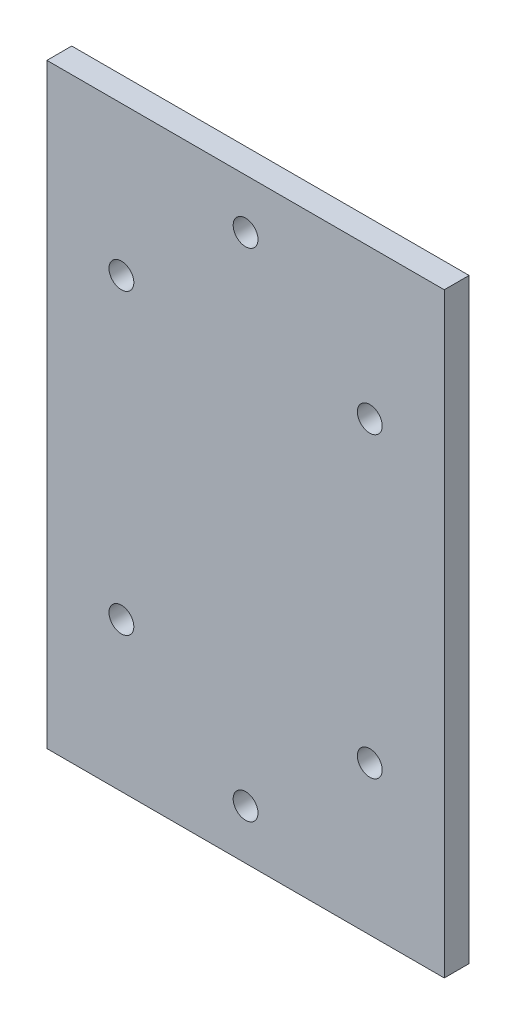
ISO-10303-21;
HEADER;
FILE_DESCRIPTION(('STEP AP214'),'2;1');
FILE_NAME('part.step','',(''),(''),'','','');
FILE_SCHEMA(('AUTOMOTIVE_DESIGN { 1 0 10303 214 1 1 1 1 }'));
ENDSEC;
DATA;
#1=APPLICATION_CONTEXT('core data for automotive mechanical design processes');
#2=APPLICATION_PROTOCOL_DEFINITION('international standard','automotive_design',2000,#1);
#3=PRODUCT_CONTEXT('',#1,'mechanical');
#4=PRODUCT('Part','Part','',(#3));
#5=PRODUCT_RELATED_PRODUCT_CATEGORY('part','',(#4));
#6=PRODUCT_DEFINITION_FORMATION('','',#4);
#7=PRODUCT_DEFINITION_CONTEXT('part definition',#1,'design');
#8=PRODUCT_DEFINITION('design','',#6,#7);
#9=PRODUCT_DEFINITION_SHAPE('','',#8);
#10=(LENGTH_UNIT() NAMED_UNIT(*) SI_UNIT(.MILLI.,.METRE.));
#11=(NAMED_UNIT(*) PLANE_ANGLE_UNIT() SI_UNIT($,.RADIAN.));
#12=(NAMED_UNIT(*) SI_UNIT($,.STERADIAN.) SOLID_ANGLE_UNIT());
#13=UNCERTAINTY_MEASURE_WITH_UNIT(LENGTH_MEASURE(1.E-05),#10,'distance_accuracy_value','');
#14=(GEOMETRIC_REPRESENTATION_CONTEXT(3) GLOBAL_UNCERTAINTY_ASSIGNED_CONTEXT((#13)) GLOBAL_UNIT_ASSIGNED_CONTEXT((#10,
#11,#12)) REPRESENTATION_CONTEXT('',''));
#15=CARTESIAN_POINT('',(0.,0.,0.));
#16=DIRECTION('',(0.,0.,1.));
#17=DIRECTION('',(1.,0.,0.));
#18=AXIS2_PLACEMENT_3D('',#15,#16,#17);
#19=CARTESIAN_POINT('',(0.,-30.,2.5));
#20=DIRECTION('',(0.,1.,0.));
#21=DIRECTION('',(0.,0.,1.));
#22=AXIS2_PLACEMENT_3D('',#19,#20,#21);
#23=PLANE('',#22);
#24=DIRECTION('',(1.,0.,0.));
#25=VECTOR('',#24,1.);
#26=CARTESIAN_POINT('',(0.,-30.,0.));
#27=LINE('',#26,#25);
#28=CARTESIAN_POINT('',(-20.,-30.,0.));
#29=VERTEX_POINT('',#28);
#30=CARTESIAN_POINT('',(20.,-30.,0.));
#31=VERTEX_POINT('',#30);
#32=EDGE_CURVE('E118',#29,#31,#27,.T.);
#33=ORIENTED_EDGE('',*,*,#32,.T.);
#34=DIRECTION('',(0.,0.,-1.));
#35=VECTOR('',#34,1.);
#36=CARTESIAN_POINT('',(20.,-30.,2.5));
#37=LINE('',#36,#35);
#38=CARTESIAN_POINT('',(20.,-30.,2.5));
#39=VERTEX_POINT('',#38);
#40=EDGE_CURVE('E11',#39,#31,#37,.T.);
#41=ORIENTED_EDGE('',*,*,#40,.F.);
#42=DIRECTION('',(1.,0.,0.));
#43=VECTOR('',#42,1.);
#44=CARTESIAN_POINT('',(0.,-30.,2.5));
#45=LINE('',#44,#43);
#46=CARTESIAN_POINT('',(-20.,-30.,2.5));
#47=VERTEX_POINT('',#46);
#48=EDGE_CURVE('E86',#47,#39,#45,.T.);
#49=ORIENTED_EDGE('',*,*,#48,.F.);
#50=DIRECTION('',(0.,0.,-1.));
#51=VECTOR('',#50,1.);
#52=CARTESIAN_POINT('',(-20.,-30.,2.5));
#53=LINE('',#52,#51);
#54=EDGE_CURVE('E52',#47,#29,#53,.T.);
#55=ORIENTED_EDGE('',*,*,#54,.T.);
#56=EDGE_LOOP('',(#33,#41,#49,#55));
#57=FACE_BOUND('',#56,.T.);
#58=ADVANCED_FACE('F35',(#57),#23,.F.);
#59=CARTESIAN_POINT('',(20.,0.,2.5));
#60=DIRECTION('',(-1.,0.,0.));
#61=DIRECTION('',(0.,0.,1.));
#62=AXIS2_PLACEMENT_3D('',#59,#60,#61);
#63=PLANE('',#62);
#64=DIRECTION('',(0.,1.,0.));
#65=VECTOR('',#64,1.);
#66=CARTESIAN_POINT('',(20.,0.,0.));
#67=LINE('',#66,#65);
#68=CARTESIAN_POINT('',(20.,30.,0.));
#69=VERTEX_POINT('',#68);
#70=EDGE_CURVE('E91',#31,#69,#67,.T.);
#71=ORIENTED_EDGE('',*,*,#70,.T.);
#72=DIRECTION('',(0.,0.,-1.));
#73=VECTOR('',#72,1.);
#74=CARTESIAN_POINT('',(20.,30.,2.5));
#75=LINE('',#74,#73);
#76=CARTESIAN_POINT('',(20.,30.,2.5));
#77=VERTEX_POINT('',#76);
#78=EDGE_CURVE('E44',#77,#69,#75,.T.);
#79=ORIENTED_EDGE('',*,*,#78,.F.);
#80=DIRECTION('',(0.,1.,0.));
#81=VECTOR('',#80,1.);
#82=CARTESIAN_POINT('',(20.,0.,2.5));
#83=LINE('',#82,#81);
#84=EDGE_CURVE('E77',#39,#77,#83,.T.);
#85=ORIENTED_EDGE('',*,*,#84,.F.);
#86=ORIENTED_EDGE('',*,*,#40,.T.);
#87=EDGE_LOOP('',(#71,#79,#85,#86));
#88=FACE_BOUND('',#87,.T.);
#89=ADVANCED_FACE('F90',(#88),#63,.F.);
#90=CARTESIAN_POINT('',(0.,30.,2.5));
#91=DIRECTION('',(0.,1.,0.));
#92=DIRECTION('',(0.,0.,1.));
#93=AXIS2_PLACEMENT_3D('',#90,#91,#92);
#94=PLANE('',#93);
#95=DIRECTION('',(1.,0.,0.));
#96=VECTOR('',#95,1.);
#97=CARTESIAN_POINT('',(0.,30.,0.));
#98=LINE('',#97,#96);
#99=CARTESIAN_POINT('',(-20.,30.,0.));
#100=VERTEX_POINT('',#99);
#101=EDGE_CURVE('E121',#100,#69,#98,.T.);
#102=ORIENTED_EDGE('',*,*,#101,.F.);
#103=DIRECTION('',(0.,0.,-1.));
#104=VECTOR('',#103,1.);
#105=CARTESIAN_POINT('',(-20.,30.,2.5));
#106=LINE('',#105,#104);
#107=CARTESIAN_POINT('',(-20.,30.,2.5));
#108=VERTEX_POINT('',#107);
#109=EDGE_CURVE('E66',#108,#100,#106,.T.);
#110=ORIENTED_EDGE('',*,*,#109,.F.);
#111=DIRECTION('',(1.,0.,0.));
#112=VECTOR('',#111,1.);
#113=CARTESIAN_POINT('',(0.,30.,2.5));
#114=LINE('',#113,#112);
#115=EDGE_CURVE('E85',#108,#77,#114,.T.);
#116=ORIENTED_EDGE('',*,*,#115,.T.);
#117=ORIENTED_EDGE('',*,*,#78,.T.);
#118=EDGE_LOOP('',(#102,#110,#116,#117));
#119=FACE_BOUND('',#118,.T.);
#120=ADVANCED_FACE('F94',(#119),#94,.T.);
#121=CARTESIAN_POINT('',(-12.5,15.,2.5));
#122=DIRECTION('',(0.,0.,-1.));
#123=DIRECTION('',(-1.,0.,0.));
#124=AXIS2_PLACEMENT_3D('',#121,#122,#123);
#125=CYLINDRICAL_SURFACE('',#124,1.25);
#126=CARTESIAN_POINT('',(-12.5,15.,2.5));
#127=DIRECTION('',(0.,0.,1.));
#128=DIRECTION('',(1.,0.,0.));
#129=AXIS2_PLACEMENT_3D('',#126,#127,#128);
#130=CIRCLE('',#129,1.25);
#131=CARTESIAN_POINT('',(-11.25,15.,2.5));
#132=VERTEX_POINT('',#131);
#133=EDGE_CURVE('E106',#132,#132,#130,.T.);
#134=ORIENTED_EDGE('',*,*,#133,.T.);
#135=EDGE_LOOP('',(#134));
#136=FACE_BOUND('',#135,.T.);
#137=CARTESIAN_POINT('',(-12.5,15.,0.));
#138=DIRECTION('',(0.,0.,1.));
#139=DIRECTION('',(1.,0.,0.));
#140=AXIS2_PLACEMENT_3D('',#137,#138,#139);
#141=CIRCLE('',#140,1.25);
#142=CARTESIAN_POINT('',(-11.25,15.,0.));
#143=VERTEX_POINT('',#142);
#144=EDGE_CURVE('E132',#143,#143,#141,.T.);
#145=ORIENTED_EDGE('',*,*,#144,.F.);
#146=EDGE_LOOP('',(#145));
#147=FACE_BOUND('',#146,.T.);
#148=ADVANCED_FACE('F190',(#136,#147),#125,.F.);
#149=CARTESIAN_POINT('',(-12.5,-15.,2.5));
#150=DIRECTION('',(0.,0.,-1.));
#151=DIRECTION('',(-1.,0.,0.));
#152=AXIS2_PLACEMENT_3D('',#149,#150,#151);
#153=CYLINDRICAL_SURFACE('',#152,1.25);
#154=CARTESIAN_POINT('',(-12.5,-15.,2.5));
#155=DIRECTION('',(0.,0.,1.));
#156=DIRECTION('',(1.,0.,0.));
#157=AXIS2_PLACEMENT_3D('',#154,#155,#156);
#158=CIRCLE('',#157,1.25);
#159=CARTESIAN_POINT('',(-11.25,-15.,2.5));
#160=VERTEX_POINT('',#159);
#161=EDGE_CURVE('E103',#160,#160,#158,.F.);
#162=ORIENTED_EDGE('',*,*,#161,.F.);
#163=EDGE_LOOP('',(#162));
#164=FACE_BOUND('',#163,.T.);
#165=CARTESIAN_POINT('',(-12.5,-15.,0.));
#166=DIRECTION('',(0.,0.,1.));
#167=DIRECTION('',(1.,0.,0.));
#168=AXIS2_PLACEMENT_3D('',#165,#166,#167);
#169=CIRCLE('',#168,1.25);
#170=CARTESIAN_POINT('',(-11.25,-15.,0.));
#171=VERTEX_POINT('',#170);
#172=EDGE_CURVE('E129',#171,#171,#169,.F.);
#173=ORIENTED_EDGE('',*,*,#172,.T.);
#174=EDGE_LOOP('',(#173));
#175=FACE_BOUND('',#174,.T.);
#176=ADVANCED_FACE('F185',(#164,#175),#153,.F.);
#177=CARTESIAN_POINT('',(12.5,-15.,2.5));
#178=DIRECTION('',(0.,0.,-1.));
#179=DIRECTION('',(-1.,0.,0.));
#180=AXIS2_PLACEMENT_3D('',#177,#178,#179);
#181=CYLINDRICAL_SURFACE('',#180,1.25);
#182=CARTESIAN_POINT('',(12.5,-15.,2.5));
#183=DIRECTION('',(0.,0.,1.));
#184=DIRECTION('',(1.,0.,0.));
#185=AXIS2_PLACEMENT_3D('',#182,#183,#184);
#186=CIRCLE('',#185,1.25);
#187=CARTESIAN_POINT('',(13.75,-15.,2.5));
#188=VERTEX_POINT('',#187);
#189=EDGE_CURVE('E97',#188,#188,#186,.T.);
#190=ORIENTED_EDGE('',*,*,#189,.T.);
#191=EDGE_LOOP('',(#190));
#192=FACE_BOUND('',#191,.T.);
#193=CARTESIAN_POINT('',(12.5,-15.,0.));
#194=DIRECTION('',(0.,0.,1.));
#195=DIRECTION('',(1.,0.,0.));
#196=AXIS2_PLACEMENT_3D('',#193,#194,#195);
#197=CIRCLE('',#196,1.25);
#198=CARTESIAN_POINT('',(13.75,-15.,0.));
#199=VERTEX_POINT('',#198);
#200=EDGE_CURVE('E126',#199,#199,#197,.T.);
#201=ORIENTED_EDGE('',*,*,#200,.F.);
#202=EDGE_LOOP('',(#201));
#203=FACE_BOUND('',#202,.T.);
#204=ADVANCED_FACE('F180',(#192,#203),#181,.F.);
#205=CARTESIAN_POINT('',(-20.,0.,2.5));
#206=DIRECTION('',(-1.,0.,0.));
#207=DIRECTION('',(0.,0.,1.));
#208=AXIS2_PLACEMENT_3D('',#205,#206,#207);
#209=PLANE('',#208);
#210=DIRECTION('',(0.,1.,0.));
#211=VECTOR('',#210,1.);
#212=CARTESIAN_POINT('',(-20.,0.,0.));
#213=LINE('',#212,#211);
#214=EDGE_CURVE('E123',#29,#100,#213,.T.);
#215=ORIENTED_EDGE('',*,*,#214,.F.);
#216=ORIENTED_EDGE('',*,*,#54,.F.);
#217=DIRECTION('',(0.,1.,0.));
#218=VECTOR('',#217,1.);
#219=CARTESIAN_POINT('',(-20.,0.,2.5));
#220=LINE('',#219,#218);
#221=EDGE_CURVE('E95',#47,#108,#220,.T.);
#222=ORIENTED_EDGE('',*,*,#221,.T.);
#223=ORIENTED_EDGE('',*,*,#109,.T.);
#224=EDGE_LOOP('',(#215,#216,#222,#223));
#225=FACE_BOUND('',#224,.T.);
#226=ADVANCED_FACE('F174',(#225),#209,.T.);
#227=CARTESIAN_POINT('',(0.,-25.,2.5));
#228=DIRECTION('',(0.,0.,-1.));
#229=DIRECTION('',(-1.,0.,0.));
#230=AXIS2_PLACEMENT_3D('',#227,#228,#229);
#231=CYLINDRICAL_SURFACE('',#230,1.25);
#232=CARTESIAN_POINT('',(0.,-25.,2.5));
#233=DIRECTION('',(0.,0.,1.));
#234=DIRECTION('',(1.,0.,0.));
#235=AXIS2_PLACEMENT_3D('',#232,#233,#234);
#236=CIRCLE('',#235,1.25);
#237=CARTESIAN_POINT('',(1.25,-25.,2.5));
#238=VERTEX_POINT('',#237);
#239=EDGE_CURVE('E143',#238,#238,#236,.T.);
#240=ORIENTED_EDGE('',*,*,#239,.T.);
#241=EDGE_LOOP('',(#240));
#242=FACE_BOUND('',#241,.T.);
#243=CARTESIAN_POINT('',(0.,-25.,0.));
#244=DIRECTION('',(0.,0.,1.));
#245=DIRECTION('',(1.,0.,0.));
#246=AXIS2_PLACEMENT_3D('',#243,#244,#245);
#247=CIRCLE('',#246,1.25);
#248=CARTESIAN_POINT('',(1.25,-25.,0.));
#249=VERTEX_POINT('',#248);
#250=EDGE_CURVE('E115',#249,#249,#247,.T.);
#251=ORIENTED_EDGE('',*,*,#250,.F.);
#252=EDGE_LOOP('',(#251));
#253=FACE_BOUND('',#252,.T.);
#254=ADVANCED_FACE('F151',(#242,#253),#231,.F.);
#255=CARTESIAN_POINT('',(0.,25.,2.5));
#256=DIRECTION('',(0.,0.,-1.));
#257=DIRECTION('',(-1.,0.,0.));
#258=AXIS2_PLACEMENT_3D('',#255,#256,#257);
#259=CYLINDRICAL_SURFACE('',#258,1.25);
#260=CARTESIAN_POINT('',(0.,25.,2.5));
#261=DIRECTION('',(0.,0.,1.));
#262=DIRECTION('',(1.,0.,0.));
#263=AXIS2_PLACEMENT_3D('',#260,#261,#262);
#264=CIRCLE('',#263,1.25);
#265=CARTESIAN_POINT('',(1.24999999999999,25.,2.5));
#266=VERTEX_POINT('',#265);
#267=EDGE_CURVE('E138',#266,#266,#264,.F.);
#268=ORIENTED_EDGE('',*,*,#267,.F.);
#269=EDGE_LOOP('',(#268));
#270=FACE_BOUND('',#269,.T.);
#271=CARTESIAN_POINT('',(0.,25.,0.));
#272=DIRECTION('',(0.,0.,1.));
#273=DIRECTION('',(1.,0.,0.));
#274=AXIS2_PLACEMENT_3D('',#271,#272,#273);
#275=CIRCLE('',#274,1.25);
#276=CARTESIAN_POINT('',(1.24999999999999,25.,0.));
#277=VERTEX_POINT('',#276);
#278=EDGE_CURVE('E112',#277,#277,#275,.F.);
#279=ORIENTED_EDGE('',*,*,#278,.T.);
#280=EDGE_LOOP('',(#279));
#281=FACE_BOUND('',#280,.T.);
#282=ADVANCED_FACE('F37',(#270,#281),#259,.F.);
#283=CARTESIAN_POINT('',(12.5,15.,2.5));
#284=DIRECTION('',(0.,0.,-1.));
#285=DIRECTION('',(-1.,0.,0.));
#286=AXIS2_PLACEMENT_3D('',#283,#284,#285);
#287=CYLINDRICAL_SURFACE('',#286,1.25);
#288=CARTESIAN_POINT('',(12.5,15.,2.5));
#289=DIRECTION('',(0.,0.,1.));
#290=DIRECTION('',(1.,0.,0.));
#291=AXIS2_PLACEMENT_3D('',#288,#289,#290);
#292=CIRCLE('',#291,1.25);
#293=CARTESIAN_POINT('',(13.75,15.,2.5));
#294=VERTEX_POINT('',#293);
#295=EDGE_CURVE('E109',#294,#294,#292,.F.);
#296=ORIENTED_EDGE('',*,*,#295,.F.);
#297=EDGE_LOOP('',(#296));
#298=FACE_BOUND('',#297,.T.);
#299=CARTESIAN_POINT('',(12.5,15.,0.));
#300=DIRECTION('',(0.,0.,1.));
#301=DIRECTION('',(1.,0.,0.));
#302=AXIS2_PLACEMENT_3D('',#299,#300,#301);
#303=CIRCLE('',#302,1.25);
#304=CARTESIAN_POINT('',(13.75,15.,0.));
#305=VERTEX_POINT('',#304);
#306=EDGE_CURVE('E135',#305,#305,#303,.F.);
#307=ORIENTED_EDGE('',*,*,#306,.T.);
#308=EDGE_LOOP('',(#307));
#309=FACE_BOUND('',#308,.T.);
#310=ADVANCED_FACE('F156',(#298,#309),#287,.F.);
#311=CARTESIAN_POINT('',(0.,0.,2.5));
#312=DIRECTION('',(0.,0.,1.));
#313=DIRECTION('',(1.,0.,0.));
#314=AXIS2_PLACEMENT_3D('',#311,#312,#313);
#315=PLANE('',#314);
#316=ORIENTED_EDGE('',*,*,#267,.T.);
#317=EDGE_LOOP('',(#316));
#318=FACE_BOUND('',#317,.T.);
#319=ORIENTED_EDGE('',*,*,#239,.F.);
#320=EDGE_LOOP('',(#319));
#321=FACE_BOUND('',#320,.T.);
#322=ORIENTED_EDGE('',*,*,#48,.T.);
#323=ORIENTED_EDGE('',*,*,#84,.T.);
#324=ORIENTED_EDGE('',*,*,#115,.F.);
#325=ORIENTED_EDGE('',*,*,#221,.F.);
#326=EDGE_LOOP('',(#322,#323,#324,#325));
#327=FACE_BOUND('',#326,.T.);
#328=ORIENTED_EDGE('',*,*,#189,.F.);
#329=EDGE_LOOP('',(#328));
#330=FACE_BOUND('',#329,.T.);
#331=ORIENTED_EDGE('',*,*,#161,.T.);
#332=EDGE_LOOP('',(#331));
#333=FACE_BOUND('',#332,.T.);
#334=ORIENTED_EDGE('',*,*,#133,.F.);
#335=EDGE_LOOP('',(#334));
#336=FACE_BOUND('',#335,.T.);
#337=ORIENTED_EDGE('',*,*,#295,.T.);
#338=EDGE_LOOP('',(#337));
#339=FACE_BOUND('',#338,.T.);
#340=ADVANCED_FACE('F81',(#318,#321,#327,#330,#333,#336,#339),#315,.T.);
#341=CARTESIAN_POINT('',(0.,0.,0.));
#342=DIRECTION('',(0.,0.,1.));
#343=DIRECTION('',(1.,0.,0.));
#344=AXIS2_PLACEMENT_3D('',#341,#342,#343);
#345=PLANE('',#344);
#346=ORIENTED_EDGE('',*,*,#278,.F.);
#347=EDGE_LOOP('',(#346));
#348=FACE_BOUND('',#347,.T.);
#349=ORIENTED_EDGE('',*,*,#250,.T.);
#350=EDGE_LOOP('',(#349));
#351=FACE_BOUND('',#350,.T.);
#352=ORIENTED_EDGE('',*,*,#32,.F.);
#353=ORIENTED_EDGE('',*,*,#214,.T.);
#354=ORIENTED_EDGE('',*,*,#101,.T.);
#355=ORIENTED_EDGE('',*,*,#70,.F.);
#356=EDGE_LOOP('',(#352,#353,#354,#355));
#357=FACE_BOUND('',#356,.T.);
#358=ORIENTED_EDGE('',*,*,#200,.T.);
#359=EDGE_LOOP('',(#358));
#360=FACE_BOUND('',#359,.T.);
#361=ORIENTED_EDGE('',*,*,#172,.F.);
#362=EDGE_LOOP('',(#361));
#363=FACE_BOUND('',#362,.T.);
#364=ORIENTED_EDGE('',*,*,#144,.T.);
#365=EDGE_LOOP('',(#364));
#366=FACE_BOUND('',#365,.T.);
#367=ORIENTED_EDGE('',*,*,#306,.F.);
#368=EDGE_LOOP('',(#367));
#369=FACE_BOUND('',#368,.T.);
#370=ADVANCED_FACE('F155',(#348,#351,#357,#360,#363,#366,#369),#345,.F.);
#371=CLOSED_SHELL('',(#58,#89,#120,#148,#176,#204,#226,#254,#282,#310,#340,#370));
#372=MANIFOLD_SOLID_BREP('B2',#371);
#373=ADVANCED_BREP_SHAPE_REPRESENTATION('',(#18,#372),#14);
#374=SHAPE_DEFINITION_REPRESENTATION(#9,#373);
ENDSEC;
END-ISO-10303-21;
